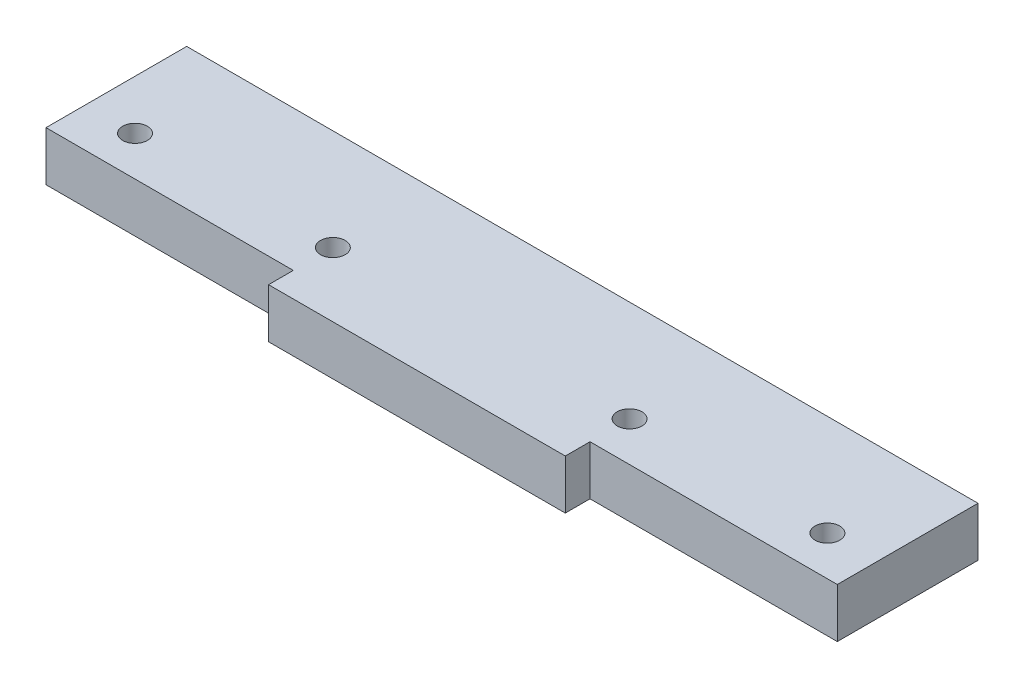
ISO-10303-21;
HEADER;
FILE_DESCRIPTION(('STEP AP214'),'2;1');
FILE_NAME('part.step','',(''),(''),'','','');
FILE_SCHEMA(('AUTOMOTIVE_DESIGN { 1 0 10303 214 1 1 1 1 }'));
ENDSEC;
DATA;
#1=APPLICATION_CONTEXT('core data for automotive mechanical design processes');
#2=APPLICATION_PROTOCOL_DEFINITION('international standard','automotive_design',2000,#1);
#3=PRODUCT_CONTEXT('',#1,'mechanical');
#4=PRODUCT('Part','Part','',(#3));
#5=PRODUCT_RELATED_PRODUCT_CATEGORY('part','',(#4));
#6=PRODUCT_DEFINITION_FORMATION('','',#4);
#7=PRODUCT_DEFINITION_CONTEXT('part definition',#1,'design');
#8=PRODUCT_DEFINITION('design','',#6,#7);
#9=PRODUCT_DEFINITION_SHAPE('','',#8);
#10=(LENGTH_UNIT() NAMED_UNIT(*) SI_UNIT(.MILLI.,.METRE.));
#11=(NAMED_UNIT(*) PLANE_ANGLE_UNIT() SI_UNIT($,.RADIAN.));
#12=(NAMED_UNIT(*) SI_UNIT($,.STERADIAN.) SOLID_ANGLE_UNIT());
#13=UNCERTAINTY_MEASURE_WITH_UNIT(LENGTH_MEASURE(1.E-05),#10,'distance_accuracy_value','');
#14=(GEOMETRIC_REPRESENTATION_CONTEXT(3) GLOBAL_UNCERTAINTY_ASSIGNED_CONTEXT((#13)) GLOBAL_UNIT_ASSIGNED_CONTEXT((#10,
#11,#12)) REPRESENTATION_CONTEXT('',''));
#15=CARTESIAN_POINT('',(0.,0.,0.));
#16=DIRECTION('',(0.,0.,1.));
#17=DIRECTION('',(1.,0.,0.));
#18=AXIS2_PLACEMENT_3D('',#15,#16,#17);
#19=CARTESIAN_POINT('',(-80.,10.,14.225));
#20=DIRECTION('',(0.,0.,-1.));
#21=DIRECTION('',(-1.,0.,0.));
#22=AXIS2_PLACEMENT_3D('',#19,#20,#21);
#23=PLANE('',#22);
#24=DIRECTION('',(0.,-1.,0.));
#25=VECTOR('',#24,1.);
#26=CARTESIAN_POINT('',(-30.,10.,14.225));
#27=LINE('',#26,#25);
#28=CARTESIAN_POINT('',(-30.,10.,14.225));
#29=VERTEX_POINT('',#28);
#30=CARTESIAN_POINT('',(-30.,0.,14.225));
#31=VERTEX_POINT('',#30);
#32=EDGE_CURVE('E47',#29,#31,#27,.T.);
#33=ORIENTED_EDGE('',*,*,#32,.F.);
#34=DIRECTION('',(1.,0.,0.));
#35=VECTOR('',#34,1.);
#36=CARTESIAN_POINT('',(-80.,10.,14.225));
#37=LINE('',#36,#35);
#38=CARTESIAN_POINT('',(-80.,10.,14.225));
#39=VERTEX_POINT('',#38);
#40=EDGE_CURVE('E139',#39,#29,#37,.T.);
#41=ORIENTED_EDGE('',*,*,#40,.F.);
#42=DIRECTION('',(0.,-1.,0.));
#43=VECTOR('',#42,1.);
#44=CARTESIAN_POINT('',(-80.,10.,14.225));
#45=LINE('',#44,#43);
#46=CARTESIAN_POINT('',(-80.,0.,14.225));
#47=VERTEX_POINT('',#46);
#48=EDGE_CURVE('E149',#39,#47,#45,.T.);
#49=ORIENTED_EDGE('',*,*,#48,.T.);
#50=DIRECTION('',(1.,0.,0.));
#51=VECTOR('',#50,1.);
#52=CARTESIAN_POINT('',(-80.,0.,14.225));
#53=LINE('',#52,#51);
#54=EDGE_CURVE('E134',#47,#31,#53,.T.);
#55=ORIENTED_EDGE('',*,*,#54,.T.);
#56=EDGE_LOOP('',(#33,#41,#49,#55));
#57=FACE_BOUND('',#56,.T.);
#58=ADVANCED_FACE('F32',(#57),#23,.F.);
#59=DIRECTION('',(0.,1.,0.));
#60=VECTOR('',#59,1.);
#61=CARTESIAN_POINT('',(30.,10.,14.225));
#62=LINE('',#61,#60);
#63=CARTESIAN_POINT('',(30.,0.,14.225));
#64=VERTEX_POINT('',#63);
#65=CARTESIAN_POINT('',(30.,10.,14.225));
#66=VERTEX_POINT('',#65);
#67=EDGE_CURVE('E55',#64,#66,#62,.T.);
#68=ORIENTED_EDGE('',*,*,#67,.F.);
#69=CARTESIAN_POINT('',(80.,0.,14.225));
#70=VERTEX_POINT('',#69);
#71=EDGE_CURVE('E145',#64,#70,#53,.T.);
#72=ORIENTED_EDGE('',*,*,#71,.T.);
#73=DIRECTION('',(0.,-1.,0.));
#74=VECTOR('',#73,1.);
#75=CARTESIAN_POINT('',(80.,10.,14.225));
#76=LINE('',#75,#74);
#77=CARTESIAN_POINT('',(80.,10.,14.225));
#78=VERTEX_POINT('',#77);
#79=EDGE_CURVE('E140',#78,#70,#76,.T.);
#80=ORIENTED_EDGE('',*,*,#79,.F.);
#81=EDGE_CURVE('E138',#66,#78,#37,.T.);
#82=ORIENTED_EDGE('',*,*,#81,.F.);
#83=EDGE_LOOP('',(#68,#72,#80,#82));
#84=FACE_BOUND('',#83,.T.);
#85=ADVANCED_FACE('F227',(#84),#23,.F.);
#86=CARTESIAN_POINT('',(80.,10.,14.225));
#87=DIRECTION('',(-1.,0.,0.));
#88=DIRECTION('',(0.,0.,1.));
#89=AXIS2_PLACEMENT_3D('',#86,#87,#88);
#90=PLANE('',#89);
#91=DIRECTION('',(0.,0.,-1.));
#92=VECTOR('',#91,1.);
#93=CARTESIAN_POINT('',(80.,0.,14.225));
#94=LINE('',#93,#92);
#95=CARTESIAN_POINT('',(80.,0.,-14.225));
#96=VERTEX_POINT('',#95);
#97=EDGE_CURVE('E121',#70,#96,#94,.T.);
#98=ORIENTED_EDGE('',*,*,#97,.T.);
#99=DIRECTION('',(0.,-1.,0.));
#100=VECTOR('',#99,1.);
#101=CARTESIAN_POINT('',(80.,10.,-14.225));
#102=LINE('',#101,#100);
#103=CARTESIAN_POINT('',(80.,10.,-14.225));
#104=VERTEX_POINT('',#103);
#105=EDGE_CURVE('E11',#104,#96,#102,.T.);
#106=ORIENTED_EDGE('',*,*,#105,.F.);
#107=DIRECTION('',(0.,0.,-1.));
#108=VECTOR('',#107,1.);
#109=CARTESIAN_POINT('',(80.,10.,14.225));
#110=LINE('',#109,#108);
#111=EDGE_CURVE('E130',#78,#104,#110,.T.);
#112=ORIENTED_EDGE('',*,*,#111,.F.);
#113=ORIENTED_EDGE('',*,*,#79,.T.);
#114=EDGE_LOOP('',(#98,#106,#112,#113));
#115=FACE_BOUND('',#114,.T.);
#116=ADVANCED_FACE('F34',(#115),#90,.F.);
#117=CARTESIAN_POINT('',(-80.,10.,-14.225));
#118=DIRECTION('',(0.,0.,1.));
#119=DIRECTION('',(1.,0.,0.));
#120=AXIS2_PLACEMENT_3D('',#117,#118,#119);
#121=PLANE('',#120);
#122=DIRECTION('',(-1.,0.,0.));
#123=VECTOR('',#122,1.);
#124=CARTESIAN_POINT('',(-80.,0.,-14.225));
#125=LINE('',#124,#123);
#126=CARTESIAN_POINT('',(-80.,0.,-14.225));
#127=VERTEX_POINT('',#126);
#128=EDGE_CURVE('E124',#96,#127,#125,.T.);
#129=ORIENTED_EDGE('',*,*,#128,.T.);
#130=DIRECTION('',(0.,-1.,0.));
#131=VECTOR('',#130,1.);
#132=CARTESIAN_POINT('',(-80.,10.,-14.225));
#133=LINE('',#132,#131);
#134=CARTESIAN_POINT('',(-80.,10.,-14.225));
#135=VERTEX_POINT('',#134);
#136=EDGE_CURVE('E40',#135,#127,#133,.T.);
#137=ORIENTED_EDGE('',*,*,#136,.F.);
#138=DIRECTION('',(-1.,0.,0.));
#139=VECTOR('',#138,1.);
#140=CARTESIAN_POINT('',(-80.,10.,-14.225));
#141=LINE('',#140,#139);
#142=EDGE_CURVE('E133',#104,#135,#141,.T.);
#143=ORIENTED_EDGE('',*,*,#142,.F.);
#144=ORIENTED_EDGE('',*,*,#105,.T.);
#145=EDGE_LOOP('',(#129,#137,#143,#144));
#146=FACE_BOUND('',#145,.T.);
#147=ADVANCED_FACE('F235',(#146),#121,.F.);
#148=CARTESIAN_POINT('',(-80.,10.,14.225));
#149=DIRECTION('',(1.,0.,0.));
#150=DIRECTION('',(0.,0.,-1.));
#151=AXIS2_PLACEMENT_3D('',#148,#149,#150);
#152=PLANE('',#151);
#153=DIRECTION('',(0.,0.,1.));
#154=VECTOR('',#153,1.);
#155=CARTESIAN_POINT('',(-80.,0.,14.225));
#156=LINE('',#155,#154);
#157=EDGE_CURVE('E143',#127,#47,#156,.T.);
#158=ORIENTED_EDGE('',*,*,#157,.T.);
#159=ORIENTED_EDGE('',*,*,#48,.F.);
#160=DIRECTION('',(0.,0.,1.));
#161=VECTOR('',#160,1.);
#162=CARTESIAN_POINT('',(-80.,10.,14.225));
#163=LINE('',#162,#161);
#164=EDGE_CURVE('E136',#135,#39,#163,.T.);
#165=ORIENTED_EDGE('',*,*,#164,.F.);
#166=ORIENTED_EDGE('',*,*,#136,.T.);
#167=EDGE_LOOP('',(#158,#159,#165,#166));
#168=FACE_BOUND('',#167,.T.);
#169=ADVANCED_FACE('F156',(#168),#152,.F.);
#170=CARTESIAN_POINT('',(0.,10.,0.));
#171=DIRECTION('',(0.,-1.,0.));
#172=DIRECTION('',(0.,0.,-1.));
#173=AXIS2_PLACEMENT_3D('',#170,#171,#172);
#174=PLANE('',#173);
#175=CARTESIAN_POINT('',(70.,10.,6.225));
#176=DIRECTION('',(0.,1.,0.));
#177=DIRECTION('',(0.,0.,1.));
#178=AXIS2_PLACEMENT_3D('',#175,#176,#177);
#179=CIRCLE('',#178,2.49999999999999);
#180=CARTESIAN_POINT('',(70.,10.,8.725));
#181=VERTEX_POINT('',#180);
#182=EDGE_CURVE('E188',#181,#181,#179,.T.);
#183=ORIENTED_EDGE('',*,*,#182,.F.);
#184=EDGE_LOOP('',(#183));
#185=FACE_BOUND('',#184,.T.);
#186=CARTESIAN_POINT('',(30.,10.,6.22500000000001));
#187=DIRECTION('',(0.,1.,0.));
#188=DIRECTION('',(0.,0.,1.));
#189=AXIS2_PLACEMENT_3D('',#186,#187,#188);
#190=CIRCLE('',#189,2.5);
#191=CARTESIAN_POINT('',(30.,10.,8.72500000000001));
#192=VERTEX_POINT('',#191);
#193=EDGE_CURVE('E182',#192,#192,#190,.T.);
#194=ORIENTED_EDGE('',*,*,#193,.F.);
#195=EDGE_LOOP('',(#194));
#196=FACE_BOUND('',#195,.T.);
#197=CARTESIAN_POINT('',(-30.,10.,6.22500000000001));
#198=DIRECTION('',(0.,1.,0.));
#199=DIRECTION('',(0.,0.,-1.));
#200=AXIS2_PLACEMENT_3D('',#197,#198,#199);
#201=CIRCLE('',#200,2.5);
#202=CARTESIAN_POINT('',(-30.,10.,3.72500000000001));
#203=VERTEX_POINT('',#202);
#204=EDGE_CURVE('E176',#203,#203,#201,.T.);
#205=ORIENTED_EDGE('',*,*,#204,.F.);
#206=EDGE_LOOP('',(#205));
#207=FACE_BOUND('',#206,.T.);
#208=CARTESIAN_POINT('',(-70.,10.,6.225));
#209=DIRECTION('',(0.,1.,0.));
#210=DIRECTION('',(0.,0.,-1.));
#211=AXIS2_PLACEMENT_3D('',#208,#209,#210);
#212=CIRCLE('',#211,2.49999999999999);
#213=CARTESIAN_POINT('',(-70.,10.,3.72500000000001));
#214=VERTEX_POINT('',#213);
#215=EDGE_CURVE('E170',#214,#214,#212,.T.);
#216=ORIENTED_EDGE('',*,*,#215,.F.);
#217=EDGE_LOOP('',(#216));
#218=FACE_BOUND('',#217,.T.);
#219=ORIENTED_EDGE('',*,*,#111,.T.);
#220=ORIENTED_EDGE('',*,*,#142,.T.);
#221=ORIENTED_EDGE('',*,*,#164,.T.);
#222=ORIENTED_EDGE('',*,*,#40,.T.);
#223=DIRECTION('',(0.,0.,-1.));
#224=VECTOR('',#223,1.);
#225=CARTESIAN_POINT('',(-30.,10.,19.225));
#226=LINE('',#225,#224);
#227=CARTESIAN_POINT('',(-30.,10.,19.225));
#228=VERTEX_POINT('',#227);
#229=EDGE_CURVE('E161',#228,#29,#226,.T.);
#230=ORIENTED_EDGE('',*,*,#229,.F.);
#231=DIRECTION('',(-1.,0.,0.));
#232=VECTOR('',#231,1.);
#233=CARTESIAN_POINT('',(-30.,10.,19.225));
#234=LINE('',#233,#232);
#235=CARTESIAN_POINT('',(30.,10.,19.225));
#236=VERTEX_POINT('',#235);
#237=EDGE_CURVE('E115',#236,#228,#234,.T.);
#238=ORIENTED_EDGE('',*,*,#237,.F.);
#239=DIRECTION('',(0.,0.,-1.));
#240=VECTOR('',#239,1.);
#241=CARTESIAN_POINT('',(30.,10.,19.225));
#242=LINE('',#241,#240);
#243=EDGE_CURVE('E126',#236,#66,#242,.T.);
#244=ORIENTED_EDGE('',*,*,#243,.T.);
#245=ORIENTED_EDGE('',*,*,#81,.T.);
#246=EDGE_LOOP('',(#219,#220,#221,#222,#230,#238,#244,#245));
#247=FACE_BOUND('',#246,.T.);
#248=ADVANCED_FACE('F160',(#185,#196,#207,#218,#247),#174,.F.);
#249=CARTESIAN_POINT('',(0.,0.,0.));
#250=DIRECTION('',(0.,-1.,0.));
#251=DIRECTION('',(0.,0.,-1.));
#252=AXIS2_PLACEMENT_3D('',#249,#250,#251);
#253=PLANE('',#252);
#254=CARTESIAN_POINT('',(70.,0.,6.225));
#255=DIRECTION('',(0.,1.,0.));
#256=DIRECTION('',(0.,0.,1.));
#257=AXIS2_PLACEMENT_3D('',#254,#255,#256);
#258=CIRCLE('',#257,2.49999999999999);
#259=CARTESIAN_POINT('',(70.,0.,8.725));
#260=VERTEX_POINT('',#259);
#261=EDGE_CURVE('E167',#260,#260,#258,.T.);
#262=ORIENTED_EDGE('',*,*,#261,.T.);
#263=EDGE_LOOP('',(#262));
#264=FACE_BOUND('',#263,.T.);
#265=CARTESIAN_POINT('',(30.,0.,6.22500000000001));
#266=DIRECTION('',(0.,1.,0.));
#267=DIRECTION('',(0.,0.,1.));
#268=AXIS2_PLACEMENT_3D('',#265,#266,#267);
#269=CIRCLE('',#268,2.5);
#270=CARTESIAN_POINT('',(30.,0.,8.72500000000001));
#271=VERTEX_POINT('',#270);
#272=EDGE_CURVE('E185',#271,#271,#269,.T.);
#273=ORIENTED_EDGE('',*,*,#272,.T.);
#274=EDGE_LOOP('',(#273));
#275=FACE_BOUND('',#274,.T.);
#276=CARTESIAN_POINT('',(-30.,0.,6.22500000000001));
#277=DIRECTION('',(0.,1.,0.));
#278=DIRECTION('',(0.,0.,-1.));
#279=AXIS2_PLACEMENT_3D('',#276,#277,#278);
#280=CIRCLE('',#279,2.5);
#281=CARTESIAN_POINT('',(-30.,0.,3.72500000000001));
#282=VERTEX_POINT('',#281);
#283=EDGE_CURVE('E179',#282,#282,#280,.T.);
#284=ORIENTED_EDGE('',*,*,#283,.T.);
#285=EDGE_LOOP('',(#284));
#286=FACE_BOUND('',#285,.T.);
#287=CARTESIAN_POINT('',(-70.,0.,6.225));
#288=DIRECTION('',(0.,1.,0.));
#289=DIRECTION('',(0.,0.,-1.));
#290=AXIS2_PLACEMENT_3D('',#287,#288,#289);
#291=CIRCLE('',#290,2.49999999999999);
#292=CARTESIAN_POINT('',(-70.,0.,3.72500000000001));
#293=VERTEX_POINT('',#292);
#294=EDGE_CURVE('E173',#293,#293,#291,.T.);
#295=ORIENTED_EDGE('',*,*,#294,.T.);
#296=EDGE_LOOP('',(#295));
#297=FACE_BOUND('',#296,.T.);
#298=ORIENTED_EDGE('',*,*,#97,.F.);
#299=ORIENTED_EDGE('',*,*,#71,.F.);
#300=DIRECTION('',(0.,0.,-1.));
#301=VECTOR('',#300,1.);
#302=CARTESIAN_POINT('',(30.,0.,19.225));
#303=LINE('',#302,#301);
#304=CARTESIAN_POINT('',(30.,0.,19.225));
#305=VERTEX_POINT('',#304);
#306=EDGE_CURVE('E106',#305,#64,#303,.T.);
#307=ORIENTED_EDGE('',*,*,#306,.F.);
#308=DIRECTION('',(1.,0.,0.));
#309=VECTOR('',#308,1.);
#310=CARTESIAN_POINT('',(-30.,0.,19.225));
#311=LINE('',#310,#309);
#312=CARTESIAN_POINT('',(-30.,0.,19.225));
#313=VERTEX_POINT('',#312);
#314=EDGE_CURVE('E98',#313,#305,#311,.T.);
#315=ORIENTED_EDGE('',*,*,#314,.F.);
#316=DIRECTION('',(0.,0.,-1.));
#317=VECTOR('',#316,1.);
#318=CARTESIAN_POINT('',(-30.,0.,19.225));
#319=LINE('',#318,#317);
#320=EDGE_CURVE('E104',#313,#31,#319,.T.);
#321=ORIENTED_EDGE('',*,*,#320,.T.);
#322=ORIENTED_EDGE('',*,*,#54,.F.);
#323=ORIENTED_EDGE('',*,*,#157,.F.);
#324=ORIENTED_EDGE('',*,*,#128,.F.);
#325=EDGE_LOOP('',(#298,#299,#307,#315,#321,#322,#323,#324));
#326=FACE_BOUND('',#325,.T.);
#327=ADVANCED_FACE('F101',(#264,#275,#286,#297,#326),#253,.T.);
#328=CARTESIAN_POINT('',(-30.,10.,19.225));
#329=DIRECTION('',(1.,0.,0.));
#330=DIRECTION('',(0.,0.,-1.));
#331=AXIS2_PLACEMENT_3D('',#328,#329,#330);
#332=PLANE('',#331);
#333=ORIENTED_EDGE('',*,*,#32,.T.);
#334=ORIENTED_EDGE('',*,*,#320,.F.);
#335=DIRECTION('',(0.,-1.,0.));
#336=VECTOR('',#335,1.);
#337=CARTESIAN_POINT('',(-30.,10.,19.225));
#338=LINE('',#337,#336);
#339=EDGE_CURVE('E110',#228,#313,#338,.T.);
#340=ORIENTED_EDGE('',*,*,#339,.F.);
#341=ORIENTED_EDGE('',*,*,#229,.T.);
#342=EDGE_LOOP('',(#333,#334,#340,#341));
#343=FACE_BOUND('',#342,.T.);
#344=ADVANCED_FACE('F120',(#343),#332,.F.);
#345=CARTESIAN_POINT('',(30.,10.,19.225));
#346=DIRECTION('',(-1.,0.,0.));
#347=DIRECTION('',(0.,0.,1.));
#348=AXIS2_PLACEMENT_3D('',#345,#346,#347);
#349=PLANE('',#348);
#350=ORIENTED_EDGE('',*,*,#67,.T.);
#351=ORIENTED_EDGE('',*,*,#243,.F.);
#352=DIRECTION('',(0.,1.,0.));
#353=VECTOR('',#352,1.);
#354=CARTESIAN_POINT('',(30.,10.,19.225));
#355=LINE('',#354,#353);
#356=EDGE_CURVE('E109',#305,#236,#355,.T.);
#357=ORIENTED_EDGE('',*,*,#356,.F.);
#358=ORIENTED_EDGE('',*,*,#306,.T.);
#359=EDGE_LOOP('',(#350,#351,#357,#358));
#360=FACE_BOUND('',#359,.T.);
#361=ADVANCED_FACE('F223',(#360),#349,.F.);
#362=CARTESIAN_POINT('',(0.,0.,19.225));
#363=DIRECTION('',(0.,0.,1.));
#364=DIRECTION('',(1.,0.,0.));
#365=AXIS2_PLACEMENT_3D('',#362,#363,#364);
#366=PLANE('',#365);
#367=ORIENTED_EDGE('',*,*,#339,.T.);
#368=ORIENTED_EDGE('',*,*,#314,.T.);
#369=ORIENTED_EDGE('',*,*,#356,.T.);
#370=ORIENTED_EDGE('',*,*,#237,.T.);
#371=EDGE_LOOP('',(#367,#368,#369,#370));
#372=FACE_BOUND('',#371,.T.);
#373=ADVANCED_FACE('F113',(#372),#366,.T.);
#374=CARTESIAN_POINT('',(-70.,0.,6.225));
#375=DIRECTION('',(0.,1.,0.));
#376=DIRECTION('',(0.,0.,1.));
#377=AXIS2_PLACEMENT_3D('',#374,#375,#376);
#378=CYLINDRICAL_SURFACE('',#377,2.49999999999999);
#379=ORIENTED_EDGE('',*,*,#294,.F.);
#380=EDGE_LOOP('',(#379));
#381=FACE_BOUND('',#380,.T.);
#382=ORIENTED_EDGE('',*,*,#215,.T.);
#383=EDGE_LOOP('',(#382));
#384=FACE_BOUND('',#383,.T.);
#385=ADVANCED_FACE('F212',(#381,#384),#378,.F.);
#386=CARTESIAN_POINT('',(-30.,0.,6.22500000000001));
#387=DIRECTION('',(0.,1.,0.));
#388=DIRECTION('',(0.,0.,1.));
#389=AXIS2_PLACEMENT_3D('',#386,#387,#388);
#390=CYLINDRICAL_SURFACE('',#389,2.5);
#391=ORIENTED_EDGE('',*,*,#283,.F.);
#392=EDGE_LOOP('',(#391));
#393=FACE_BOUND('',#392,.T.);
#394=ORIENTED_EDGE('',*,*,#204,.T.);
#395=EDGE_LOOP('',(#394));
#396=FACE_BOUND('',#395,.T.);
#397=ADVANCED_FACE('F214',(#393,#396),#390,.F.);
#398=CARTESIAN_POINT('',(30.,0.,6.22500000000001));
#399=DIRECTION('',(0.,1.,0.));
#400=DIRECTION('',(0.,0.,1.));
#401=AXIS2_PLACEMENT_3D('',#398,#399,#400);
#402=CYLINDRICAL_SURFACE('',#401,2.5);
#403=ORIENTED_EDGE('',*,*,#272,.F.);
#404=EDGE_LOOP('',(#403));
#405=FACE_BOUND('',#404,.T.);
#406=ORIENTED_EDGE('',*,*,#193,.T.);
#407=EDGE_LOOP('',(#406));
#408=FACE_BOUND('',#407,.T.);
#409=ADVANCED_FACE('F199',(#405,#408),#402,.F.);
#410=CARTESIAN_POINT('',(70.,0.,6.225));
#411=DIRECTION('',(0.,1.,0.));
#412=DIRECTION('',(0.,0.,1.));
#413=AXIS2_PLACEMENT_3D('',#410,#411,#412);
#414=CYLINDRICAL_SURFACE('',#413,2.49999999999999);
#415=ORIENTED_EDGE('',*,*,#261,.F.);
#416=EDGE_LOOP('',(#415));
#417=FACE_BOUND('',#416,.T.);
#418=ORIENTED_EDGE('',*,*,#182,.T.);
#419=EDGE_LOOP('',(#418));
#420=FACE_BOUND('',#419,.T.);
#421=ADVANCED_FACE('F196',(#417,#420),#414,.F.);
#422=CLOSED_SHELL('',(#58,#85,#116,#147,#169,#248,#327,#344,#361,#373,#385,#397,#409,#421));
#423=MANIFOLD_SOLID_BREP('B2',#422);
#424=ADVANCED_BREP_SHAPE_REPRESENTATION('',(#18,#423),#14);
#425=SHAPE_DEFINITION_REPRESENTATION(#9,#424);
ENDSEC;
END-ISO-10303-21;
